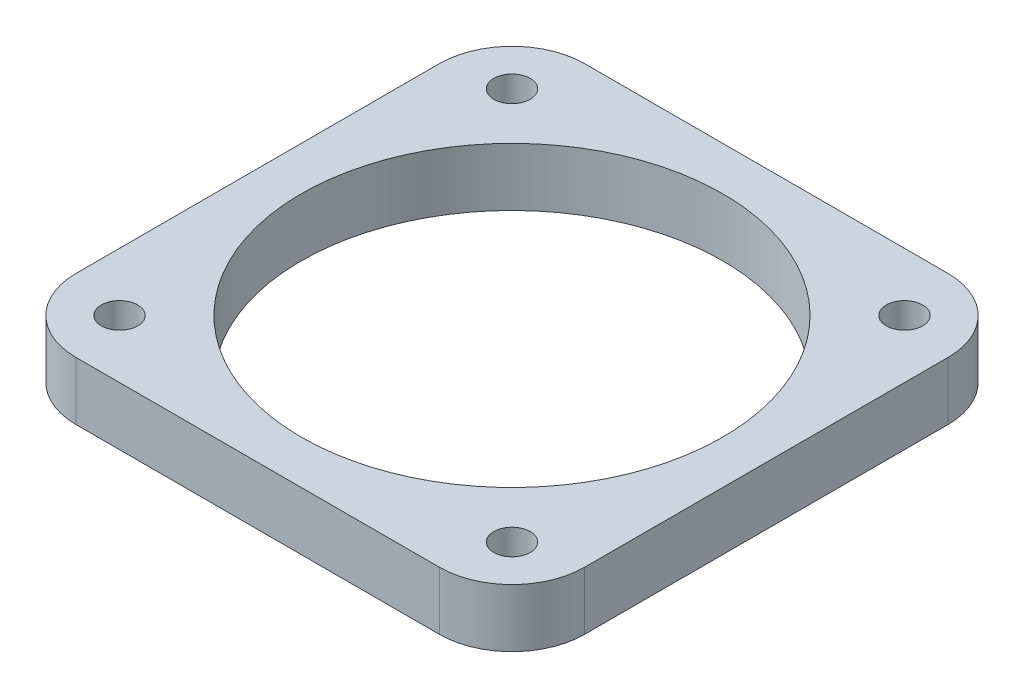
ISO-10303-21;
HEADER;
FILE_DESCRIPTION(('STEP AP214'),'2;1');
FILE_NAME('part.step','',(''),(''),'','','');
FILE_SCHEMA(('AUTOMOTIVE_DESIGN { 1 0 10303 214 1 1 1 1 }'));
ENDSEC;
DATA;
#1=APPLICATION_CONTEXT('core data for automotive mechanical design processes');
#2=APPLICATION_PROTOCOL_DEFINITION('international standard','automotive_design',2000,#1);
#3=PRODUCT_CONTEXT('',#1,'mechanical');
#4=PRODUCT('Part','Part','',(#3));
#5=PRODUCT_RELATED_PRODUCT_CATEGORY('part','',(#4));
#6=PRODUCT_DEFINITION_FORMATION('','',#4);
#7=PRODUCT_DEFINITION_CONTEXT('part definition',#1,'design');
#8=PRODUCT_DEFINITION('design','',#6,#7);
#9=PRODUCT_DEFINITION_SHAPE('','',#8);
#10=(LENGTH_UNIT() NAMED_UNIT(*) SI_UNIT(.MILLI.,.METRE.));
#11=(NAMED_UNIT(*) PLANE_ANGLE_UNIT() SI_UNIT($,.RADIAN.));
#12=(NAMED_UNIT(*) SI_UNIT($,.STERADIAN.) SOLID_ANGLE_UNIT());
#13=UNCERTAINTY_MEASURE_WITH_UNIT(LENGTH_MEASURE(1.E-05),#10,'distance_accuracy_value','');
#14=(GEOMETRIC_REPRESENTATION_CONTEXT(3) GLOBAL_UNCERTAINTY_ASSIGNED_CONTEXT((#13)) GLOBAL_UNIT_ASSIGNED_CONTEXT((#10,
#11,#12)) REPRESENTATION_CONTEXT('',''));
#15=CARTESIAN_POINT('',(0.,0.,0.));
#16=DIRECTION('',(0.,0.,1.));
#17=DIRECTION('',(1.,0.,0.));
#18=AXIS2_PLACEMENT_3D('',#15,#16,#17);
#19=CARTESIAN_POINT('',(-35.,8.,0.));
#20=DIRECTION('',(1.,0.,0.));
#21=DIRECTION('',(0.,0.,-1.));
#22=AXIS2_PLACEMENT_3D('',#19,#20,#21);
#23=PLANE('',#22);
#24=DIRECTION('',(0.,0.,1.));
#25=VECTOR('',#24,1.);
#26=CARTESIAN_POINT('',(-35.,0.,0.));
#27=LINE('',#26,#25);
#28=CARTESIAN_POINT('',(-35.,0.,-25.));
#29=VERTEX_POINT('',#28);
#30=CARTESIAN_POINT('',(-35.,0.,25.));
#31=VERTEX_POINT('',#30);
#32=EDGE_CURVE('E130',#29,#31,#27,.T.);
#33=ORIENTED_EDGE('',*,*,#32,.T.);
#34=DIRECTION('',(0.,-1.,0.));
#35=VECTOR('',#34,1.);
#36=CARTESIAN_POINT('',(-35.,8.,25.));
#37=LINE('',#36,#35);
#38=CARTESIAN_POINT('',(-35.,8.,25.));
#39=VERTEX_POINT('',#38);
#40=EDGE_CURVE('E108',#31,#39,#37,.F.);
#41=ORIENTED_EDGE('',*,*,#40,.T.);
#42=DIRECTION('',(0.,0.,1.));
#43=VECTOR('',#42,1.);
#44=CARTESIAN_POINT('',(-35.,8.,0.));
#45=LINE('',#44,#43);
#46=CARTESIAN_POINT('',(-35.,8.,-25.));
#47=VERTEX_POINT('',#46);
#48=EDGE_CURVE('E185',#47,#39,#45,.T.);
#49=ORIENTED_EDGE('',*,*,#48,.F.);
#50=DIRECTION('',(0.,-1.,0.));
#51=VECTOR('',#50,1.);
#52=CARTESIAN_POINT('',(-35.,0.,-25.));
#53=LINE('',#52,#51);
#54=EDGE_CURVE('E113',#47,#29,#53,.T.);
#55=ORIENTED_EDGE('',*,*,#54,.T.);
#56=EDGE_LOOP('',(#33,#41,#49,#55));
#57=FACE_BOUND('',#56,.T.);
#58=ADVANCED_FACE('F35',(#57),#23,.F.);
#59=CARTESIAN_POINT('',(0.,8.,35.));
#60=DIRECTION('',(0.,0.,-1.));
#61=DIRECTION('',(-1.,0.,0.));
#62=AXIS2_PLACEMENT_3D('',#59,#60,#61);
#63=PLANE('',#62);
#64=DIRECTION('',(1.,0.,0.));
#65=VECTOR('',#64,1.);
#66=CARTESIAN_POINT('',(0.,8.,35.));
#67=LINE('',#66,#65);
#68=CARTESIAN_POINT('',(-25.,8.,35.));
#69=VERTEX_POINT('',#68);
#70=CARTESIAN_POINT('',(25.,8.,35.));
#71=VERTEX_POINT('',#70);
#72=EDGE_CURVE('E123',#69,#71,#67,.T.);
#73=ORIENTED_EDGE('',*,*,#72,.F.);
#74=DIRECTION('',(0.,-1.,0.));
#75=VECTOR('',#74,1.);
#76=CARTESIAN_POINT('',(-25.,8.,35.));
#77=LINE('',#76,#75);
#78=CARTESIAN_POINT('',(-25.,0.,35.));
#79=VERTEX_POINT('',#78);
#80=EDGE_CURVE('E107',#69,#79,#77,.T.);
#81=ORIENTED_EDGE('',*,*,#80,.T.);
#82=DIRECTION('',(1.,0.,0.));
#83=VECTOR('',#82,1.);
#84=CARTESIAN_POINT('',(0.,0.,35.));
#85=LINE('',#84,#83);
#86=CARTESIAN_POINT('',(25.,0.,35.));
#87=VERTEX_POINT('',#86);
#88=EDGE_CURVE('E120',#79,#87,#85,.T.);
#89=ORIENTED_EDGE('',*,*,#88,.T.);
#90=DIRECTION('',(0.,-1.,0.));
#91=VECTOR('',#90,1.);
#92=CARTESIAN_POINT('',(25.,8.,35.));
#93=LINE('',#92,#91);
#94=EDGE_CURVE('E125',#87,#71,#93,.F.);
#95=ORIENTED_EDGE('',*,*,#94,.T.);
#96=EDGE_LOOP('',(#73,#81,#89,#95));
#97=FACE_BOUND('',#96,.T.);
#98=ADVANCED_FACE('F119',(#97),#63,.F.);
#99=CARTESIAN_POINT('',(35.,8.,0.));
#100=DIRECTION('',(1.,0.,0.));
#101=DIRECTION('',(0.,0.,-1.));
#102=AXIS2_PLACEMENT_3D('',#99,#100,#101);
#103=PLANE('',#102);
#104=DIRECTION('',(0.,0.,1.));
#105=VECTOR('',#104,1.);
#106=CARTESIAN_POINT('',(35.,0.,0.));
#107=LINE('',#106,#105);
#108=CARTESIAN_POINT('',(35.,0.,-25.));
#109=VERTEX_POINT('',#108);
#110=CARTESIAN_POINT('',(35.,0.,25.));
#111=VERTEX_POINT('',#110);
#112=EDGE_CURVE('E129',#109,#111,#107,.T.);
#113=ORIENTED_EDGE('',*,*,#112,.F.);
#114=DIRECTION('',(0.,-1.,0.));
#115=VECTOR('',#114,1.);
#116=CARTESIAN_POINT('',(35.,8.,-25.));
#117=LINE('',#116,#115);
#118=CARTESIAN_POINT('',(35.,8.,-25.));
#119=VERTEX_POINT('',#118);
#120=EDGE_CURVE('E11',#109,#119,#117,.F.);
#121=ORIENTED_EDGE('',*,*,#120,.T.);
#122=DIRECTION('',(0.,0.,1.));
#123=VECTOR('',#122,1.);
#124=CARTESIAN_POINT('',(35.,8.,0.));
#125=LINE('',#124,#123);
#126=CARTESIAN_POINT('',(35.,8.,25.));
#127=VERTEX_POINT('',#126);
#128=EDGE_CURVE('E181',#119,#127,#125,.T.);
#129=ORIENTED_EDGE('',*,*,#128,.T.);
#130=DIRECTION('',(0.,-1.,0.));
#131=VECTOR('',#130,1.);
#132=CARTESIAN_POINT('',(35.,0.,25.));
#133=LINE('',#132,#131);
#134=EDGE_CURVE('E44',#127,#111,#133,.T.);
#135=ORIENTED_EDGE('',*,*,#134,.T.);
#136=EDGE_LOOP('',(#113,#121,#129,#135));
#137=FACE_BOUND('',#136,.T.);
#138=ADVANCED_FACE('F226',(#137),#103,.T.);
#139=CARTESIAN_POINT('',(0.,8.,0.));
#140=DIRECTION('',(0.,-1.,0.));
#141=DIRECTION('',(0.,0.,-1.));
#142=AXIS2_PLACEMENT_3D('',#139,#140,#141);
#143=CYLINDRICAL_SURFACE('',#142,29.);
#144=CARTESIAN_POINT('',(0.,8.,0.));
#145=DIRECTION('',(0.,1.,0.));
#146=DIRECTION('',(0.,0.,1.));
#147=AXIS2_PLACEMENT_3D('',#144,#145,#146);
#148=CIRCLE('',#147,29.);
#149=CARTESIAN_POINT('',(0.,8.,29.));
#150=VERTEX_POINT('',#149);
#151=EDGE_CURVE('E140',#150,#150,#148,.T.);
#152=ORIENTED_EDGE('',*,*,#151,.T.);
#153=EDGE_LOOP('',(#152));
#154=FACE_BOUND('',#153,.T.);
#155=CARTESIAN_POINT('',(0.,0.,0.));
#156=DIRECTION('',(0.,1.,0.));
#157=DIRECTION('',(0.,0.,1.));
#158=AXIS2_PLACEMENT_3D('',#155,#156,#157);
#159=CIRCLE('',#158,29.);
#160=CARTESIAN_POINT('',(0.,0.,29.));
#161=VERTEX_POINT('',#160);
#162=EDGE_CURVE('E134',#161,#161,#159,.T.);
#163=ORIENTED_EDGE('',*,*,#162,.F.);
#164=EDGE_LOOP('',(#163));
#165=FACE_BOUND('',#164,.T.);
#166=ADVANCED_FACE('F246',(#154,#165),#143,.F.);
#167=CARTESIAN_POINT('',(0.,8.,-35.));
#168=DIRECTION('',(0.,0.,-1.));
#169=DIRECTION('',(-1.,0.,0.));
#170=AXIS2_PLACEMENT_3D('',#167,#168,#169);
#171=PLANE('',#170);
#172=DIRECTION('',(1.,0.,0.));
#173=VECTOR('',#172,1.);
#174=CARTESIAN_POINT('',(0.,0.,-35.));
#175=LINE('',#174,#173);
#176=CARTESIAN_POINT('',(-25.,0.,-35.));
#177=VERTEX_POINT('',#176);
#178=CARTESIAN_POINT('',(25.,0.,-35.));
#179=VERTEX_POINT('',#178);
#180=EDGE_CURVE('E132',#177,#179,#175,.T.);
#181=ORIENTED_EDGE('',*,*,#180,.F.);
#182=DIRECTION('',(0.,-1.,0.));
#183=VECTOR('',#182,1.);
#184=CARTESIAN_POINT('',(-25.,8.,-35.));
#185=LINE('',#184,#183);
#186=CARTESIAN_POINT('',(-25.,8.,-35.));
#187=VERTEX_POINT('',#186);
#188=EDGE_CURVE('E59',#177,#187,#185,.F.);
#189=ORIENTED_EDGE('',*,*,#188,.T.);
#190=DIRECTION('',(1.,0.,0.));
#191=VECTOR('',#190,1.);
#192=CARTESIAN_POINT('',(0.,8.,-35.));
#193=LINE('',#192,#191);
#194=CARTESIAN_POINT('',(25.,8.,-35.));
#195=VERTEX_POINT('',#194);
#196=EDGE_CURVE('E141',#187,#195,#193,.T.);
#197=ORIENTED_EDGE('',*,*,#196,.T.);
#198=DIRECTION('',(0.,-1.,0.));
#199=VECTOR('',#198,1.);
#200=CARTESIAN_POINT('',(25.,8.,-35.));
#201=LINE('',#200,#199);
#202=EDGE_CURVE('E157',#195,#179,#201,.T.);
#203=ORIENTED_EDGE('',*,*,#202,.T.);
#204=EDGE_LOOP('',(#181,#189,#197,#203));
#205=FACE_BOUND('',#204,.T.);
#206=ADVANCED_FACE('F208',(#205),#171,.T.);
#207=CARTESIAN_POINT('',(0.,8.,0.));
#208=DIRECTION('',(0.,1.,0.));
#209=DIRECTION('',(0.,0.,1.));
#210=AXIS2_PLACEMENT_3D('',#207,#208,#209);
#211=PLANE('',#210);
#212=CARTESIAN_POINT('',(-27.,8.,27.));
#213=DIRECTION('',(0.,1.,0.));
#214=DIRECTION('',(0.,0.,1.));
#215=AXIS2_PLACEMENT_3D('',#212,#213,#214);
#216=CIRCLE('',#215,2.5);
#217=CARTESIAN_POINT('',(-27.,8.,29.5));
#218=VERTEX_POINT('',#217);
#219=EDGE_CURVE('E193',#218,#218,#216,.T.);
#220=ORIENTED_EDGE('',*,*,#219,.F.);
#221=EDGE_LOOP('',(#220));
#222=FACE_BOUND('',#221,.T.);
#223=CARTESIAN_POINT('',(27.,8.,27.));
#224=DIRECTION('',(0.,1.,0.));
#225=DIRECTION('',(0.,0.,1.));
#226=AXIS2_PLACEMENT_3D('',#223,#224,#225);
#227=CIRCLE('',#226,2.5);
#228=CARTESIAN_POINT('',(27.,8.,29.5));
#229=VERTEX_POINT('',#228);
#230=EDGE_CURVE('E196',#229,#229,#227,.T.);
#231=ORIENTED_EDGE('',*,*,#230,.F.);
#232=EDGE_LOOP('',(#231));
#233=FACE_BOUND('',#232,.T.);
#234=CARTESIAN_POINT('',(27.,8.,-27.));
#235=DIRECTION('',(0.,1.,0.));
#236=DIRECTION('',(0.,0.,1.));
#237=AXIS2_PLACEMENT_3D('',#234,#235,#236);
#238=CIRCLE('',#237,2.5);
#239=CARTESIAN_POINT('',(27.,8.,-24.5));
#240=VERTEX_POINT('',#239);
#241=EDGE_CURVE('E192',#240,#240,#238,.T.);
#242=ORIENTED_EDGE('',*,*,#241,.F.);
#243=EDGE_LOOP('',(#242));
#244=FACE_BOUND('',#243,.T.);
#245=CARTESIAN_POINT('',(-27.,8.,-27.));
#246=DIRECTION('',(0.,1.,0.));
#247=DIRECTION('',(0.,0.,1.));
#248=AXIS2_PLACEMENT_3D('',#245,#246,#247);
#249=CIRCLE('',#248,2.5);
#250=CARTESIAN_POINT('',(-27.,8.,-24.5));
#251=VERTEX_POINT('',#250);
#252=EDGE_CURVE('E167',#251,#251,#249,.T.);
#253=ORIENTED_EDGE('',*,*,#252,.F.);
#254=EDGE_LOOP('',(#253));
#255=FACE_BOUND('',#254,.T.);
#256=ORIENTED_EDGE('',*,*,#151,.F.);
#257=EDGE_LOOP('',(#256));
#258=FACE_BOUND('',#257,.T.);
#259=ORIENTED_EDGE('',*,*,#48,.T.);
#260=CARTESIAN_POINT('',(-25.,8.,25.));
#261=DIRECTION('',(0.,1.,0.));
#262=DIRECTION('',(0.,0.,1.));
#263=AXIS2_PLACEMENT_3D('',#260,#261,#262);
#264=CIRCLE('',#263,10.);
#265=EDGE_CURVE('E155',#39,#69,#264,.T.);
#266=ORIENTED_EDGE('',*,*,#265,.T.);
#267=ORIENTED_EDGE('',*,*,#72,.T.);
#268=CARTESIAN_POINT('',(25.,8.,25.));
#269=DIRECTION('',(0.,1.,0.));
#270=DIRECTION('',(0.,0.,1.));
#271=AXIS2_PLACEMENT_3D('',#268,#269,#270);
#272=CIRCLE('',#271,10.);
#273=EDGE_CURVE('E150',#71,#127,#272,.T.);
#274=ORIENTED_EDGE('',*,*,#273,.T.);
#275=ORIENTED_EDGE('',*,*,#128,.F.);
#276=CARTESIAN_POINT('',(25.,8.,-25.));
#277=DIRECTION('',(0.,1.,0.));
#278=DIRECTION('',(0.,0.,1.));
#279=AXIS2_PLACEMENT_3D('',#276,#277,#278);
#280=CIRCLE('',#279,10.);
#281=EDGE_CURVE('E52',#119,#195,#280,.T.);
#282=ORIENTED_EDGE('',*,*,#281,.T.);
#283=ORIENTED_EDGE('',*,*,#196,.F.);
#284=CARTESIAN_POINT('',(-25.,8.,-25.));
#285=DIRECTION('',(0.,1.,0.));
#286=DIRECTION('',(0.,0.,1.));
#287=AXIS2_PLACEMENT_3D('',#284,#285,#286);
#288=CIRCLE('',#287,10.);
#289=EDGE_CURVE('E153',#187,#47,#288,.T.);
#290=ORIENTED_EDGE('',*,*,#289,.T.);
#291=EDGE_LOOP('',(#259,#266,#267,#274,#275,#282,#283,#290));
#292=FACE_BOUND('',#291,.T.);
#293=ADVANCED_FACE('F205',(#222,#233,#244,#255,#258,#292),#211,.T.);
#294=CARTESIAN_POINT('',(0.,0.,0.));
#295=DIRECTION('',(0.,1.,0.));
#296=DIRECTION('',(0.,0.,1.));
#297=AXIS2_PLACEMENT_3D('',#294,#295,#296);
#298=PLANE('',#297);
#299=CARTESIAN_POINT('',(-27.,0.,27.));
#300=DIRECTION('',(0.,1.,0.));
#301=DIRECTION('',(0.,0.,1.));
#302=AXIS2_PLACEMENT_3D('',#299,#300,#301);
#303=CIRCLE('',#302,2.5);
#304=CARTESIAN_POINT('',(-27.,0.,29.5));
#305=VERTEX_POINT('',#304);
#306=EDGE_CURVE('E39',#305,#305,#303,.T.);
#307=ORIENTED_EDGE('',*,*,#306,.T.);
#308=EDGE_LOOP('',(#307));
#309=FACE_BOUND('',#308,.T.);
#310=CARTESIAN_POINT('',(27.,0.,27.));
#311=DIRECTION('',(0.,1.,0.));
#312=DIRECTION('',(0.,0.,1.));
#313=AXIS2_PLACEMENT_3D('',#310,#311,#312);
#314=CIRCLE('',#313,2.5);
#315=CARTESIAN_POINT('',(27.,0.,29.5));
#316=VERTEX_POINT('',#315);
#317=EDGE_CURVE('E169',#316,#316,#314,.T.);
#318=ORIENTED_EDGE('',*,*,#317,.T.);
#319=EDGE_LOOP('',(#318));
#320=FACE_BOUND('',#319,.T.);
#321=CARTESIAN_POINT('',(27.,0.,-27.));
#322=DIRECTION('',(0.,1.,0.));
#323=DIRECTION('',(0.,0.,1.));
#324=AXIS2_PLACEMENT_3D('',#321,#322,#323);
#325=CIRCLE('',#324,2.5);
#326=CARTESIAN_POINT('',(27.,0.,-24.5));
#327=VERTEX_POINT('',#326);
#328=EDGE_CURVE('E166',#327,#327,#325,.T.);
#329=ORIENTED_EDGE('',*,*,#328,.T.);
#330=EDGE_LOOP('',(#329));
#331=FACE_BOUND('',#330,.T.);
#332=CARTESIAN_POINT('',(-27.,0.,-27.));
#333=DIRECTION('',(0.,1.,0.));
#334=DIRECTION('',(0.,0.,1.));
#335=AXIS2_PLACEMENT_3D('',#332,#333,#334);
#336=CIRCLE('',#335,2.5);
#337=CARTESIAN_POINT('',(-27.,0.,-24.5));
#338=VERTEX_POINT('',#337);
#339=EDGE_CURVE('E163',#338,#338,#336,.T.);
#340=ORIENTED_EDGE('',*,*,#339,.T.);
#341=EDGE_LOOP('',(#340));
#342=FACE_BOUND('',#341,.T.);
#343=ORIENTED_EDGE('',*,*,#162,.T.);
#344=EDGE_LOOP('',(#343));
#345=FACE_BOUND('',#344,.T.);
#346=ORIENTED_EDGE('',*,*,#88,.F.);
#347=CARTESIAN_POINT('',(-25.,0.,25.));
#348=DIRECTION('',(0.,1.,0.));
#349=DIRECTION('',(0.,0.,1.));
#350=AXIS2_PLACEMENT_3D('',#347,#348,#349);
#351=CIRCLE('',#350,10.);
#352=EDGE_CURVE('E103',#79,#31,#351,.F.);
#353=ORIENTED_EDGE('',*,*,#352,.T.);
#354=ORIENTED_EDGE('',*,*,#32,.F.);
#355=CARTESIAN_POINT('',(-25.,0.,-25.));
#356=DIRECTION('',(0.,1.,0.));
#357=DIRECTION('',(0.,0.,1.));
#358=AXIS2_PLACEMENT_3D('',#355,#356,#357);
#359=CIRCLE('',#358,10.);
#360=EDGE_CURVE('E114',#29,#177,#359,.F.);
#361=ORIENTED_EDGE('',*,*,#360,.T.);
#362=ORIENTED_EDGE('',*,*,#180,.T.);
#363=CARTESIAN_POINT('',(25.,0.,-25.));
#364=DIRECTION('',(0.,1.,0.));
#365=DIRECTION('',(0.,0.,1.));
#366=AXIS2_PLACEMENT_3D('',#363,#364,#365);
#367=CIRCLE('',#366,10.);
#368=EDGE_CURVE('E144',#179,#109,#367,.F.);
#369=ORIENTED_EDGE('',*,*,#368,.T.);
#370=ORIENTED_EDGE('',*,*,#112,.T.);
#371=CARTESIAN_POINT('',(25.,0.,25.));
#372=DIRECTION('',(0.,1.,0.));
#373=DIRECTION('',(0.,0.,1.));
#374=AXIS2_PLACEMENT_3D('',#371,#372,#373);
#375=CIRCLE('',#374,10.);
#376=EDGE_CURVE('E124',#111,#87,#375,.F.);
#377=ORIENTED_EDGE('',*,*,#376,.T.);
#378=EDGE_LOOP('',(#346,#353,#354,#361,#362,#369,#370,#377));
#379=FACE_BOUND('',#378,.T.);
#380=ADVANCED_FACE('F127',(#309,#320,#331,#342,#345,#379),#298,.F.);
#381=CARTESIAN_POINT('',(-25.,8.,25.));
#382=DIRECTION('',(0.,-1.,0.));
#383=DIRECTION('',(0.,0.,-1.));
#384=AXIS2_PLACEMENT_3D('',#381,#382,#383);
#385=CYLINDRICAL_SURFACE('',#384,10.);
#386=ORIENTED_EDGE('',*,*,#265,.F.);
#387=ORIENTED_EDGE('',*,*,#40,.F.);
#388=ORIENTED_EDGE('',*,*,#352,.F.);
#389=ORIENTED_EDGE('',*,*,#80,.F.);
#390=EDGE_LOOP('',(#386,#387,#388,#389));
#391=FACE_BOUND('',#390,.T.);
#392=ADVANCED_FACE('F106',(#391),#385,.T.);
#393=CARTESIAN_POINT('',(-25.,8.,-25.));
#394=DIRECTION('',(0.,1.,0.));
#395=DIRECTION('',(0.,0.,1.));
#396=AXIS2_PLACEMENT_3D('',#393,#394,#395);
#397=CYLINDRICAL_SURFACE('',#396,10.);
#398=ORIENTED_EDGE('',*,*,#289,.F.);
#399=ORIENTED_EDGE('',*,*,#188,.F.);
#400=ORIENTED_EDGE('',*,*,#360,.F.);
#401=ORIENTED_EDGE('',*,*,#54,.F.);
#402=EDGE_LOOP('',(#398,#399,#400,#401));
#403=FACE_BOUND('',#402,.T.);
#404=ADVANCED_FACE('F219',(#403),#397,.T.);
#405=CARTESIAN_POINT('',(25.,8.,-25.));
#406=DIRECTION('',(0.,-1.,0.));
#407=DIRECTION('',(0.,0.,-1.));
#408=AXIS2_PLACEMENT_3D('',#405,#406,#407);
#409=CYLINDRICAL_SURFACE('',#408,10.);
#410=ORIENTED_EDGE('',*,*,#281,.F.);
#411=ORIENTED_EDGE('',*,*,#120,.F.);
#412=ORIENTED_EDGE('',*,*,#368,.F.);
#413=ORIENTED_EDGE('',*,*,#202,.F.);
#414=EDGE_LOOP('',(#410,#411,#412,#413));
#415=FACE_BOUND('',#414,.T.);
#416=ADVANCED_FACE('F222',(#415),#409,.T.);
#417=CARTESIAN_POINT('',(25.,8.,25.));
#418=DIRECTION('',(0.,1.,0.));
#419=DIRECTION('',(0.,0.,1.));
#420=AXIS2_PLACEMENT_3D('',#417,#418,#419);
#421=CYLINDRICAL_SURFACE('',#420,10.);
#422=ORIENTED_EDGE('',*,*,#273,.F.);
#423=ORIENTED_EDGE('',*,*,#94,.F.);
#424=ORIENTED_EDGE('',*,*,#376,.F.);
#425=ORIENTED_EDGE('',*,*,#134,.F.);
#426=EDGE_LOOP('',(#422,#423,#424,#425));
#427=FACE_BOUND('',#426,.T.);
#428=ADVANCED_FACE('F37',(#427),#421,.T.);
#429=CARTESIAN_POINT('',(-27.,-2.,-27.));
#430=DIRECTION('',(0.,1.,0.));
#431=DIRECTION('',(0.,0.,1.));
#432=AXIS2_PLACEMENT_3D('',#429,#430,#431);
#433=CYLINDRICAL_SURFACE('',#432,2.5);
#434=ORIENTED_EDGE('',*,*,#252,.T.);
#435=EDGE_LOOP('',(#434));
#436=FACE_BOUND('',#435,.T.);
#437=ORIENTED_EDGE('',*,*,#339,.F.);
#438=EDGE_LOOP('',(#437));
#439=FACE_BOUND('',#438,.T.);
#440=ADVANCED_FACE('F231',(#436,#439),#433,.F.);
#441=CARTESIAN_POINT('',(27.,-2.,-27.));
#442=DIRECTION('',(0.,1.,0.));
#443=DIRECTION('',(0.,0.,1.));
#444=AXIS2_PLACEMENT_3D('',#441,#442,#443);
#445=CYLINDRICAL_SURFACE('',#444,2.5);
#446=ORIENTED_EDGE('',*,*,#241,.T.);
#447=EDGE_LOOP('',(#446));
#448=FACE_BOUND('',#447,.T.);
#449=ORIENTED_EDGE('',*,*,#328,.F.);
#450=EDGE_LOOP('',(#449));
#451=FACE_BOUND('',#450,.T.);
#452=ADVANCED_FACE('F202',(#448,#451),#445,.F.);
#453=CARTESIAN_POINT('',(27.,-2.,27.));
#454=DIRECTION('',(0.,1.,0.));
#455=DIRECTION('',(0.,0.,1.));
#456=AXIS2_PLACEMENT_3D('',#453,#454,#455);
#457=CYLINDRICAL_SURFACE('',#456,2.5);
#458=ORIENTED_EDGE('',*,*,#230,.T.);
#459=EDGE_LOOP('',(#458));
#460=FACE_BOUND('',#459,.T.);
#461=ORIENTED_EDGE('',*,*,#317,.F.);
#462=EDGE_LOOP('',(#461));
#463=FACE_BOUND('',#462,.T.);
#464=ADVANCED_FACE('F299',(#460,#463),#457,.F.);
#465=CARTESIAN_POINT('',(-27.,-2.,27.));
#466=DIRECTION('',(0.,1.,0.));
#467=DIRECTION('',(0.,0.,1.));
#468=AXIS2_PLACEMENT_3D('',#465,#466,#467);
#469=CYLINDRICAL_SURFACE('',#468,2.5);
#470=ORIENTED_EDGE('',*,*,#219,.T.);
#471=EDGE_LOOP('',(#470));
#472=FACE_BOUND('',#471,.T.);
#473=ORIENTED_EDGE('',*,*,#306,.F.);
#474=EDGE_LOOP('',(#473));
#475=FACE_BOUND('',#474,.T.);
#476=ADVANCED_FACE('F308',(#472,#475),#469,.F.);
#477=CLOSED_SHELL('',(#58,#98,#138,#166,#206,#293,#380,#392,#404,#416,#428,#440,#452,#464,#476));
#478=MANIFOLD_SOLID_BREP('B2',#477);
#479=ADVANCED_BREP_SHAPE_REPRESENTATION('',(#18,#478),#14);
#480=SHAPE_DEFINITION_REPRESENTATION(#9,#479);
ENDSEC;
END-ISO-10303-21;
